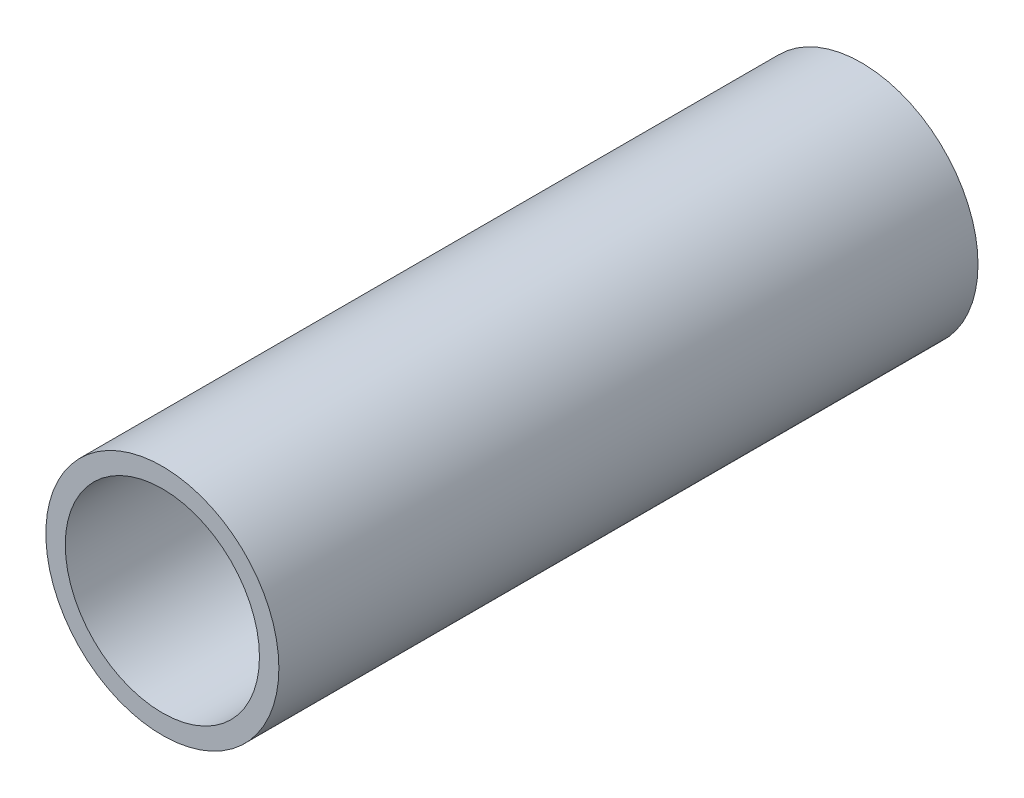
ISO-10303-21;
HEADER;
FILE_DESCRIPTION(('STEP AP214'),'2;1');
FILE_NAME('part.step','',(''),(''),'','','');
FILE_SCHEMA(('AUTOMOTIVE_DESIGN { 1 0 10303 214 1 1 1 1 }'));
ENDSEC;
DATA;
#1=APPLICATION_CONTEXT('core data for automotive mechanical design processes');
#2=APPLICATION_PROTOCOL_DEFINITION('international standard','automotive_design',2000,#1);
#3=PRODUCT_CONTEXT('',#1,'mechanical');
#4=PRODUCT('Part','Part','',(#3));
#5=PRODUCT_RELATED_PRODUCT_CATEGORY('part','',(#4));
#6=PRODUCT_DEFINITION_FORMATION('','',#4);
#7=PRODUCT_DEFINITION_CONTEXT('part definition',#1,'design');
#8=PRODUCT_DEFINITION('design','',#6,#7);
#9=PRODUCT_DEFINITION_SHAPE('','',#8);
#10=(LENGTH_UNIT() NAMED_UNIT(*) SI_UNIT(.MILLI.,.METRE.));
#11=(NAMED_UNIT(*) PLANE_ANGLE_UNIT() SI_UNIT($,.RADIAN.));
#12=(NAMED_UNIT(*) SI_UNIT($,.STERADIAN.) SOLID_ANGLE_UNIT());
#13=UNCERTAINTY_MEASURE_WITH_UNIT(LENGTH_MEASURE(1.E-05),#10,'distance_accuracy_value','');
#14=(GEOMETRIC_REPRESENTATION_CONTEXT(3) GLOBAL_UNCERTAINTY_ASSIGNED_CONTEXT((#13)) GLOBAL_UNIT_ASSIGNED_CONTEXT((#10,
#11,#12)) REPRESENTATION_CONTEXT('',''));
#15=CARTESIAN_POINT('',(0.,0.,0.));
#16=DIRECTION('',(0.,0.,1.));
#17=DIRECTION('',(1.,0.,0.));
#18=AXIS2_PLACEMENT_3D('',#15,#16,#17);
#19=CARTESIAN_POINT('',(0.,0.,18.));
#20=DIRECTION('',(0.,0.,1.));
#21=DIRECTION('',(1.,0.,0.));
#22=AXIS2_PLACEMENT_3D('',#19,#20,#21);
#23=PLANE('',#22);
#24=CARTESIAN_POINT('',(0.,0.,18.));
#25=DIRECTION('',(0.,0.,1.));
#26=DIRECTION('',(1.,0.,0.));
#27=AXIS2_PLACEMENT_3D('',#24,#25,#26);
#28=CIRCLE('',#27,3.);
#29=CARTESIAN_POINT('',(3.,0.,18.));
#30=VERTEX_POINT('',#29);
#31=EDGE_CURVE('E10',#30,#30,#28,.T.);
#32=ORIENTED_EDGE('',*,*,#31,.T.);
#33=EDGE_LOOP('',(#32));
#34=FACE_BOUND('',#33,.T.);
#35=CARTESIAN_POINT('',(0.,0.,18.));
#36=DIRECTION('',(0.,0.,1.));
#37=DIRECTION('',(1.,0.,0.));
#38=AXIS2_PLACEMENT_3D('',#35,#36,#37);
#39=CIRCLE('',#38,2.5);
#40=CARTESIAN_POINT('',(2.5,0.,18.));
#41=VERTEX_POINT('',#40);
#42=EDGE_CURVE('E43',#41,#41,#39,.T.);
#43=ORIENTED_EDGE('',*,*,#42,.F.);
#44=EDGE_LOOP('',(#43));
#45=FACE_BOUND('',#44,.T.);
#46=ADVANCED_FACE('F32',(#34,#45),#23,.T.);
#47=CARTESIAN_POINT('',(0.,0.,0.));
#48=DIRECTION('',(0.,0.,1.));
#49=DIRECTION('',(1.,0.,0.));
#50=AXIS2_PLACEMENT_3D('',#47,#48,#49);
#51=PLANE('',#50);
#52=CARTESIAN_POINT('',(0.,0.,0.));
#53=DIRECTION('',(0.,0.,1.));
#54=DIRECTION('',(1.,0.,0.));
#55=AXIS2_PLACEMENT_3D('',#52,#53,#54);
#56=CIRCLE('',#55,3.);
#57=CARTESIAN_POINT('',(3.,0.,0.));
#58=VERTEX_POINT('',#57);
#59=EDGE_CURVE('E36',#58,#58,#56,.T.);
#60=ORIENTED_EDGE('',*,*,#59,.F.);
#61=EDGE_LOOP('',(#60));
#62=FACE_BOUND('',#61,.T.);
#63=CARTESIAN_POINT('',(0.,0.,0.));
#64=DIRECTION('',(0.,0.,1.));
#65=DIRECTION('',(1.,0.,0.));
#66=AXIS2_PLACEMENT_3D('',#63,#64,#65);
#67=CIRCLE('',#66,2.5);
#68=CARTESIAN_POINT('',(2.5,0.,0.));
#69=VERTEX_POINT('',#68);
#70=EDGE_CURVE('E45',#69,#69,#67,.T.);
#71=ORIENTED_EDGE('',*,*,#70,.T.);
#72=EDGE_LOOP('',(#71));
#73=FACE_BOUND('',#72,.T.);
#74=ADVANCED_FACE('F55',(#62,#73),#51,.F.);
#75=CARTESIAN_POINT('',(0.,0.,18.));
#76=DIRECTION('',(0.,0.,-1.));
#77=DIRECTION('',(-1.,0.,0.));
#78=AXIS2_PLACEMENT_3D('',#75,#76,#77);
#79=CYLINDRICAL_SURFACE('',#78,3.);
#80=ORIENTED_EDGE('',*,*,#31,.F.);
#81=EDGE_LOOP('',(#80));
#82=FACE_BOUND('',#81,.T.);
#83=ORIENTED_EDGE('',*,*,#59,.T.);
#84=EDGE_LOOP('',(#83));
#85=FACE_BOUND('',#84,.T.);
#86=ADVANCED_FACE('F34',(#82,#85),#79,.T.);
#87=CARTESIAN_POINT('',(0.,0.,18.));
#88=DIRECTION('',(0.,0.,-1.));
#89=DIRECTION('',(-1.,0.,0.));
#90=AXIS2_PLACEMENT_3D('',#87,#88,#89);
#91=CYLINDRICAL_SURFACE('',#90,2.5);
#92=ORIENTED_EDGE('',*,*,#42,.T.);
#93=EDGE_LOOP('',(#92));
#94=FACE_BOUND('',#93,.T.);
#95=ORIENTED_EDGE('',*,*,#70,.F.);
#96=EDGE_LOOP('',(#95));
#97=FACE_BOUND('',#96,.T.);
#98=ADVANCED_FACE('F51',(#94,#97),#91,.F.);
#99=CLOSED_SHELL('',(#46,#74,#86,#98));
#100=MANIFOLD_SOLID_BREP('B2',#99);
#101=ADVANCED_BREP_SHAPE_REPRESENTATION('',(#18,#100),#14);
#102=SHAPE_DEFINITION_REPRESENTATION(#9,#101);
ENDSEC;
END-ISO-10303-21;
